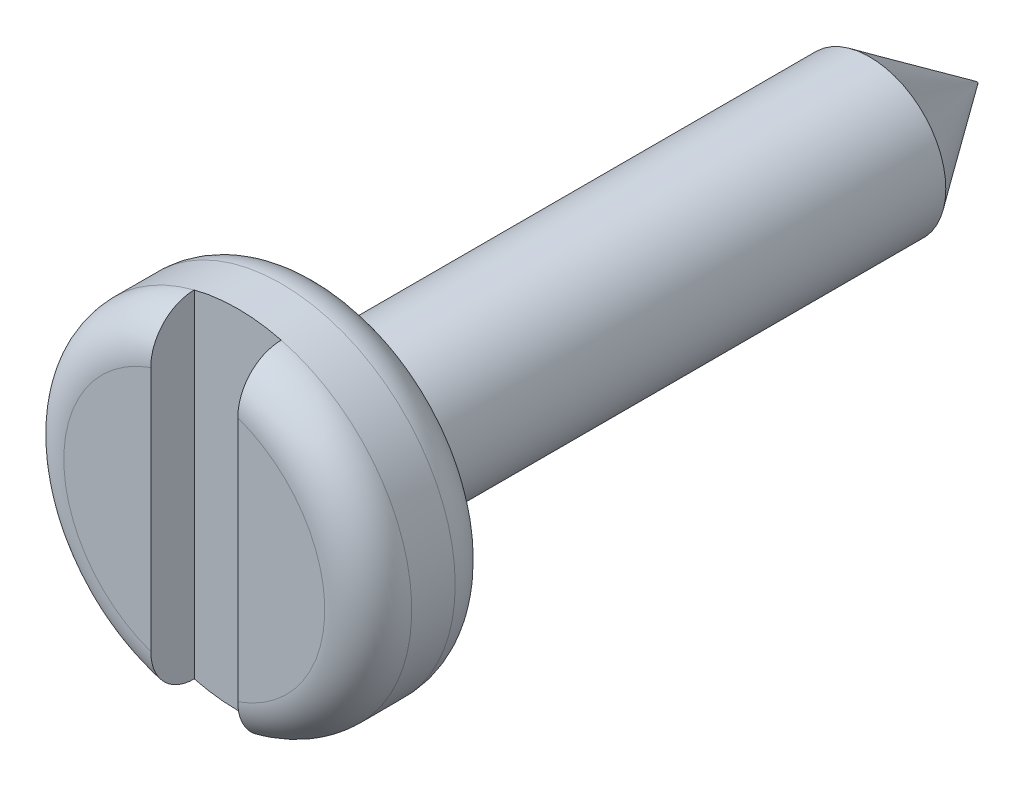
ISO-10303-21;
HEADER;
FILE_DESCRIPTION(('STEP AP214'),'2;1');
FILE_NAME('part.step','',(''),(''),'','','');
FILE_SCHEMA(('AUTOMOTIVE_DESIGN { 1 0 10303 214 1 1 1 1 }'));
ENDSEC;
DATA;
#1=APPLICATION_CONTEXT('core data for automotive mechanical design processes');
#2=APPLICATION_PROTOCOL_DEFINITION('international standard','automotive_design',2000,#1);
#3=PRODUCT_CONTEXT('',#1,'mechanical');
#4=PRODUCT('Part','Part','',(#3));
#5=PRODUCT_RELATED_PRODUCT_CATEGORY('part','',(#4));
#6=PRODUCT_DEFINITION_FORMATION('','',#4);
#7=PRODUCT_DEFINITION_CONTEXT('part definition',#1,'design');
#8=PRODUCT_DEFINITION('design','',#6,#7);
#9=PRODUCT_DEFINITION_SHAPE('','',#8);
#10=(LENGTH_UNIT() NAMED_UNIT(*) SI_UNIT(.MILLI.,.METRE.));
#11=(NAMED_UNIT(*) PLANE_ANGLE_UNIT() SI_UNIT($,.RADIAN.));
#12=(NAMED_UNIT(*) SI_UNIT($,.STERADIAN.) SOLID_ANGLE_UNIT());
#13=UNCERTAINTY_MEASURE_WITH_UNIT(LENGTH_MEASURE(1.E-05),#10,'distance_accuracy_value','');
#14=(GEOMETRIC_REPRESENTATION_CONTEXT(3) GLOBAL_UNCERTAINTY_ASSIGNED_CONTEXT((#13)) GLOBAL_UNIT_ASSIGNED_CONTEXT((#10,
#11,#12)) REPRESENTATION_CONTEXT('',''));
#15=CARTESIAN_POINT('',(0.,0.,0.));
#16=DIRECTION('',(0.,0.,1.));
#17=DIRECTION('',(1.,0.,0.));
#18=AXIS2_PLACEMENT_3D('',#15,#16,#17);
#19=CARTESIAN_POINT('',(0.,0.,3.));
#20=DIRECTION('',(0.,0.,1.));
#21=DIRECTION('',(1.,0.,0.));
#22=AXIS2_PLACEMENT_3D('',#19,#20,#21);
#23=PLANE('',#22);
#24=DIRECTION('',(0.,1.,0.));
#25=VECTOR('',#24,1.);
#26=CARTESIAN_POINT('',(1.,-5.25777871776012,3.));
#27=LINE('',#26,#25);
#28=CARTESIAN_POINT('',(1.,-2.82842712474619,3.));
#29=VERTEX_POINT('',#28);
#30=CARTESIAN_POINT('',(1.,2.82842712474619,3.));
#31=VERTEX_POINT('',#30);
#32=EDGE_CURVE('E80',#29,#31,#27,.T.);
#33=ORIENTED_EDGE('',*,*,#32,.F.);
#34=CARTESIAN_POINT('',(0.,0.,3.));
#35=DIRECTION('',(0.,0.,1.));
#36=DIRECTION('',(1.,0.,0.));
#37=AXIS2_PLACEMENT_3D('',#34,#35,#36);
#38=CIRCLE('',#37,3.);
#39=EDGE_CURVE('E91',#29,#31,#38,.T.);
#40=ORIENTED_EDGE('',*,*,#39,.T.);
#41=EDGE_LOOP('',(#33,#40));
#42=FACE_BOUND('',#41,.T.);
#43=ADVANCED_FACE('F36',(#42),#23,.T.);
#44=CARTESIAN_POINT('',(0.,0.,2.));
#45=DIRECTION('',(0.,0.,1.));
#46=DIRECTION('',(1.,0.,0.));
#47=AXIS2_PLACEMENT_3D('',#44,#45,#46);
#48=TOROIDAL_SURFACE('',#47,3.,1.);
#49=CARTESIAN_POINT('',(1.,-3.64919261637876,2.6211026661572));
#50=CARTESIAN_POINT('',(1.,-3.61246829124284,2.66579002494271));
#51=CARTESIAN_POINT('',(1.,-3.57182273981753,2.70732733314953));
#52=CARTESIAN_POINT('',(1.,-3.48403011681508,2.78294045930634));
#53=CARTESIAN_POINT('',(1.,-3.43687198294722,2.81700332070253));
#54=CARTESIAN_POINT('',(1.,-3.33766471841515,2.87674097422314));
#55=CARTESIAN_POINT('',(1.,-3.28562703698927,2.90243479890157));
#56=CARTESIAN_POINT('',(1.,-3.17810296997573,2.94502972447431));
#57=CARTESIAN_POINT('',(1.,-3.12261754108754,2.96193325245766));
#58=CARTESIAN_POINT('',(1.,-3.00777317104801,2.98715700817281));
#59=CARTESIAN_POINT('',(1.,-2.94834671261764,2.99516919827913));
#60=CARTESIAN_POINT('',(1.,-2.82897631989347,3.00159564116463));
#61=CARTESIAN_POINT('',(1.,-2.76903224055403,3.00000711035689));
#62=CARTESIAN_POINT('',(1.,-2.64727083843189,2.9871577074426));
#63=CARTESIAN_POINT('',(1.,-2.58550212430651,2.97543521119548));
#64=CARTESIAN_POINT('',(1.,-2.4646697470406,2.94214822582074));
#65=CARTESIAN_POINT('',(1.,-2.40560678606223,2.92058119770941));
#66=CARTESIAN_POINT('',(1.,-2.28977043599634,2.86727838900606));
#67=CARTESIAN_POINT('',(1.,-2.23314594038648,2.83521799768237));
#68=CARTESIAN_POINT('',(1.,-2.12614398768344,2.76191505713469));
#69=CARTESIAN_POINT('',(1.,-2.07576824200821,2.72067000100721));
#70=CARTESIAN_POINT('',(1.,-1.98379387873605,2.63055763944395));
#71=CARTESIAN_POINT('',(1.,-1.94207572966021,2.58181298471903));
#72=CARTESIAN_POINT('',(1.,-1.86845583157665,2.47738621897952));
#73=CARTESIAN_POINT('',(1.,-1.83654566049022,2.42171011803187));
#74=CARTESIAN_POINT('',(1.,-1.78709737368201,2.31073529638438));
#75=CARTESIAN_POINT('',(1.,-1.76846247440006,2.25592758061431));
#76=CARTESIAN_POINT('',(1.,-1.74214733309541,2.14375873883025));
#77=CARTESIAN_POINT('',(1.,-1.73445420066598,2.086400699661));
#78=CARTESIAN_POINT('',(1.,-1.73084715779128,1.97843775997684));
#79=CARTESIAN_POINT('',(1.,-1.7335962352882,1.92787339768217));
#80=CARTESIAN_POINT('',(1.,-1.74776639815729,1.82798056341897));
#81=CARTESIAN_POINT('',(1.,-1.75918748554878,1.77865209173822));
#82=CARTESIAN_POINT('',(1.,-1.78968272820642,1.68365989826979));
#83=CARTESIAN_POINT('',(1.,-1.8085812374816,1.63793910856491));
#84=CARTESIAN_POINT('',(1.,-1.85313687686153,1.54993212977883));
#85=CARTESIAN_POINT('',(1.,-1.87879592715948,1.50764692097559));
#86=CARTESIAN_POINT('',(1.,-1.93861992774949,1.42344159371426));
#87=CARTESIAN_POINT('',(1.,-1.9733576123982,1.38192920716076));
#88=CARTESIAN_POINT('',(1.,-2.04862460837548,1.30454213941451));
#89=CARTESIAN_POINT('',(1.,-2.08915670758346,1.26867018956461));
#90=CARTESIAN_POINT('',(1.,-2.18006426230812,1.19918972913197));
#91=CARTESIAN_POINT('',(1.,-2.23103714592975,1.16636107677538));
#92=CARTESIAN_POINT('',(1.,-2.33749595959869,1.10908092926408));
#93=CARTESIAN_POINT('',(1.,-2.39298358522971,1.08463259961096));
#94=CARTESIAN_POINT('',(1.,-2.51097262656985,1.0433220937882));
#95=CARTESIAN_POINT('',(1.,-2.57369454510079,1.02708587787039));
#96=CARTESIAN_POINT('',(1.,-2.700983475594,1.00537639094104));
#97=CARTESIAN_POINT('',(1.,-2.76555060284081,0.99990379391447));
#98=CARTESIAN_POINT('',(1.,-2.89460991780328,1.00009863370848));
#99=CARTESIAN_POINT('',(1.,-2.95910210766962,1.00575347593341));
#100=CARTESIAN_POINT('',(1.,-3.08610159103586,1.02829216053746));
#101=CARTESIAN_POINT('',(1.,-3.14860929616319,1.04517365809634));
#102=CARTESIAN_POINT('',(1.,-3.26706008823211,1.08898927984344));
#103=CARTESIAN_POINT('',(1.,-3.32316790541548,1.1154775406286));
#104=CARTESIAN_POINT('',(1.,-3.42981180048591,1.17797155695129));
#105=CARTESIAN_POINT('',(1.,-3.48034948276044,1.21397456171506));
#106=CARTESIAN_POINT('',(1.,-3.5717549595939,1.2925348236677));
#107=CARTESIAN_POINT('',(1.,-3.61297761225985,1.33467936693552));
#108=CARTESIAN_POINT('',(1.,-3.68739921164548,1.42554288437418));
#109=CARTESIAN_POINT('',(1.,-3.72060013192047,1.47426023685665));
#110=CARTESIAN_POINT('',(1.,-3.77666180946586,1.57475604354721));
#111=CARTESIAN_POINT('',(1.,-3.79988449445979,1.62633279669513));
#112=CARTESIAN_POINT('',(1.,-3.8370874932321,1.73271545651262));
#113=CARTESIAN_POINT('',(1.,-3.85106974548789,1.78752068327712));
#114=CARTESIAN_POINT('',(1.,-3.86908893013128,1.89732662152739));
#115=CARTESIAN_POINT('',(1.,-3.8733663936881,1.95228799006894));
#116=CARTESIAN_POINT('',(1.,-3.87254642808437,2.06215628299846));
#117=CARTESIAN_POINT('',(1.,-3.86744696286752,2.11706319297142));
#118=CARTESIAN_POINT('',(1.,-3.84811915821359,2.22478524017462));
#119=CARTESIAN_POINT('',(1.,-3.83396358370818,2.27761351927618));
#120=CARTESIAN_POINT('',(1.,-3.7970545910158,2.38011640408008));
#121=CARTESIAN_POINT('',(1.,-3.77431302491925,2.42979524735174));
#122=CARTESIAN_POINT('',(1.,-3.73340181697249,2.50259332314218));
#123=CARTESIAN_POINT('',(1.,-3.71802299051624,2.52732160058586));
#124=CARTESIAN_POINT('',(1.,-3.6851578718343,2.57533329531705));
#125=CARTESIAN_POINT('',(1.,-3.66767165706015,2.59861676565705));
#126=CARTESIAN_POINT('',(1.,-3.64919261637876,2.6211026661572));
#127=B_SPLINE_CURVE_WITH_KNOTS('',3,(#49,#50,#51,#52,#53,#54,#55,#56,#57,#58,#59,#60,#61,#62,
#63,#64,#65,#66,#67,#68,#69,#70,#71,#72,#73,#74,#75,#76,#77,#78,#79,#80,#81,#82,#83,#84,#85,#86,
#87,#88,#89,#90,#91,#92,#93,#94,#95,#96,#97,#98,#99,#100,#101,#102,#103,#104,#105,#106,#107,
#108,#109,#110,#111,#112,#113,#114,#115,#116,#117,#118,#119,#120,#121,#122,#123,#124,#125,#126),
.UNSPECIFIED.,.T.,.F.,(4,2,2,2,2,2,2,2,2,2,2,2,2,2,2,2,2,2,2,2,2,2,2,2,2,2,2,2,2,2,2,2,2,2,2,2,
2,2,4),(0.,0.17341289048321,0.347124049007961,0.520437356131996,0.69370278427219,
0.872799829737299,1.0519488042302,1.23971596911835,1.42753158804966,1.62181514087839,
1.81615178746787,2.00759452225808,2.19887240354153,2.37152756897142,2.54397916179065,
2.69513969078691,2.8463002549815,2.99410284817722,3.14194746701218,3.30368559089984,
3.4655017957534,3.64661194733467,3.82779043451023,4.02124009008946,4.21470185851019,
4.40794478311448,4.60114735931068,4.78633868776633,4.97147653467569,5.14744892261805,
5.32337797257932,5.49223680329954,5.6610601992052,5.82565137676776,5.99027829700087,
6.15359879124429,6.31669465754746,6.40395620932971,6.49121455501904),.UNSPECIFIED.);
#128=CARTESIAN_POINT('',(1.,-3.87298334620742,2.));
#129=VERTEX_POINT('',#128);
#130=EDGE_CURVE('E77',#129,#29,#127,.T.);
#131=ORIENTED_EDGE('',*,*,#130,.F.);
#132=CARTESIAN_POINT('',(0.,0.,2.));
#133=DIRECTION('',(0.,0.,1.));
#134=DIRECTION('',(1.,0.,0.));
#135=AXIS2_PLACEMENT_3D('',#132,#133,#134);
#136=CIRCLE('',#135,4.);
#137=CARTESIAN_POINT('',(1.,3.87298334620742,2.));
#138=VERTEX_POINT('',#137);
#139=EDGE_CURVE('E177',#138,#129,#136,.F.);
#140=ORIENTED_EDGE('',*,*,#139,.F.);
#141=CARTESIAN_POINT('',(1.,1.80454052912611,2.34958766832458));
#142=CARTESIAN_POINT('',(1.,1.82733564227056,2.40301531347153));
#143=CARTESIAN_POINT('',(1.,1.85512695409011,2.45438971925694));
#144=CARTESIAN_POINT('',(1.,1.91917221491779,2.55165941167524));
#145=CARTESIAN_POINT('',(1.,1.95545034759685,2.59753846325667));
#146=CARTESIAN_POINT('',(1.,2.03472745512996,2.68258486169766));
#147=CARTESIAN_POINT('',(1.,2.07768954567703,2.7217867062309));
#148=CARTESIAN_POINT('',(1.,2.16909853569401,2.7930735569373));
#149=CARTESIAN_POINT('',(1.,2.21754271430982,2.82516207038143));
#150=CARTESIAN_POINT('',(1.,2.32292879249958,2.8840516403355));
#151=CARTESIAN_POINT('',(1.,2.38024241475681,2.91018930933951));
#152=CARTESIAN_POINT('',(1.,2.49835854595117,2.95285912482168));
#153=CARTESIAN_POINT('',(1.,2.55916237767374,2.96938760266272));
#154=CARTESIAN_POINT('',(1.,2.68483407257146,2.99270373861452));
#155=CARTESIAN_POINT('',(1.,2.74976968404556,2.9991297669534));
#156=CARTESIAN_POINT('',(1.,2.87978602000167,3.0007047130659));
#157=CARTESIAN_POINT('',(1.,2.94486673043529,2.99585467892842));
#158=CARTESIAN_POINT('',(1.,3.07160057441872,2.97500301118191));
#159=CARTESIAN_POINT('',(1.,3.13329857714227,2.95927559681278));
#160=CARTESIAN_POINT('',(1.,3.25294779689383,2.91715819140186));
#161=CARTESIAN_POINT('',(1.,3.31090002929504,2.8907711040785));
#162=CARTESIAN_POINT('',(1.,3.41840060401574,2.82944986634712));
#163=CARTESIAN_POINT('',(1.,3.46821977750479,2.79499057017331));
#164=CARTESIAN_POINT('',(1.,3.56099783551873,2.71781891288443));
#165=CARTESIAN_POINT('',(1.,3.60395862641663,2.67510885249285));
#166=CARTESIAN_POINT('',(1.,3.67969826358568,2.58481461557238));
#167=CARTESIAN_POINT('',(1.,3.71285769774479,2.53754946305995));
#168=CARTESIAN_POINT('',(1.,3.77044619987703,2.43796937327648));
#169=CARTESIAN_POINT('',(1.,3.79487711958101,2.38565551007047));
#170=CARTESIAN_POINT('',(1.,3.8335016955855,2.27936335145154));
#171=CARTESIAN_POINT('',(1.,3.84801099359635,2.22549959047232));
#172=CARTESIAN_POINT('',(1.,3.86760231954654,2.11608517443674));
#173=CARTESIAN_POINT('',(1.,3.87268548576308,2.06053472388451));
#174=CARTESIAN_POINT('',(1.,3.8732508221602,1.95035504782268));
#175=CARTESIAN_POINT('',(1.,3.86889832192387,1.89572659120488));
#176=CARTESIAN_POINT('',(1.,3.85107174509836,1.78798168894991));
#177=CARTESIAN_POINT('',(1.,3.83759798402113,1.73486519107906));
#178=CARTESIAN_POINT('',(1.,3.80198008919852,1.63168371377876));
#179=CARTESIAN_POINT('',(1.,3.77984406569282,1.58161593044612));
#180=CARTESIAN_POINT('',(1.,3.72759926122775,1.48583394126099));
#181=CARTESIAN_POINT('',(1.,3.69749012843155,1.44011992765242));
#182=CARTESIAN_POINT('',(1.,3.62971259861727,1.35357917161315));
#183=CARTESIAN_POINT('',(1.,3.59193770980213,1.31283590863564));
#184=CARTESIAN_POINT('',(1.,3.51026030542915,1.23804950219452));
#185=CARTESIAN_POINT('',(1.,3.46635709112837,1.20400712382448));
#186=CARTESIAN_POINT('',(1.,3.37229757441458,1.1424726173594));
#187=CARTESIAN_POINT('',(1.,3.3219939157208,1.11520592258916));
#188=CARTESIAN_POINT('',(1.,3.21766120608909,1.06912019119455));
#189=CARTESIAN_POINT('',(1.,3.16363149652713,1.05030265249747));
#190=CARTESIAN_POINT('',(1.,3.05096434144294,1.02078522720702));
#191=CARTESIAN_POINT('',(1.,2.99222867204826,1.01046061252006));
#192=CARTESIAN_POINT('',(1.,2.87386575261448,0.999331319218379));
#193=CARTESIAN_POINT('',(1.,2.81423829904846,0.998528848039069));
#194=CARTESIAN_POINT('',(1.,2.69274321411743,1.00645205739125));
#195=CARTESIAN_POINT('',(1.,2.63090545892967,1.01563700166145));
#196=CARTESIAN_POINT('',(1.,2.50951757591248,1.04386266996607));
#197=CARTESIAN_POINT('',(1.,2.44996803355343,1.06290589857502));
#198=CARTESIAN_POINT('',(1.,2.33251699096482,1.11120194285693));
#199=CARTESIAN_POINT('',(1.,2.27476209452056,1.1408123586987));
#200=CARTESIAN_POINT('',(1.,2.16504100441597,1.20936090341473));
#201=CARTESIAN_POINT('',(1.,2.1130766184798,1.24830193330297));
#202=CARTESIAN_POINT('',(1.,2.01702604048045,1.33440542147592));
#203=CARTESIAN_POINT('',(1.,1.97289236593093,1.38151464491305));
#204=CARTESIAN_POINT('',(1.,1.89405458528472,1.48307465886792));
#205=CARTESIAN_POINT('',(1.,1.8593436749435,1.53752010910422));
#206=CARTESIAN_POINT('',(1.,1.80395346955058,1.6472212237122));
#207=CARTESIAN_POINT('',(1.,1.78231146726499,1.701988240954));
#208=CARTESIAN_POINT('',(1.,1.75007375885358,1.81468813753041));
#209=CARTESIAN_POINT('',(1.,1.73946751412064,1.87261794080383));
#210=CARTESIAN_POINT('',(1.,1.73072871128562,1.98197840524538));
#211=CARTESIAN_POINT('',(1.,1.73118407976636,2.03330096094744));
#212=CARTESIAN_POINT('',(1.,1.74110754539552,2.13501149229802));
#213=CARTESIAN_POINT('',(1.,1.75056109441266,2.18540084269791));
#214=CARTESIAN_POINT('',(1.,1.76962628570817,2.25416086039941));
#215=CARTESIAN_POINT('',(1.,1.775725641812,2.27356752733858));
#216=CARTESIAN_POINT('',(1.,1.78919300721113,2.31192913575159));
#217=CARTESIAN_POINT('',(1.,1.79656062731025,2.33088421378046));
#218=CARTESIAN_POINT('',(1.,1.80454052912611,2.34958766832458));
#219=B_SPLINE_CURVE_WITH_KNOTS('',3,(#141,#142,#143,#144,#145,#146,#147,#148,#149,#150,#151,
#152,#153,#154,#155,#156,#157,#158,#159,#160,#161,#162,#163,#164,#165,#166,#167,#168,#169,#170,
#171,#172,#173,#174,#175,#176,#177,#178,#179,#180,#181,#182,#183,#184,#185,#186,#187,#188,#189,
#190,#191,#192,#193,#194,#195,#196,#197,#198,#199,#200,#201,#202,#203,#204,#205,#206,#207,#208,
#209,#210,#211,#212,#213,#214,#215,#216,#217,#218),.UNSPECIFIED.,.T.,.F.,(4,2,2,2,2,2,2,2,2,2,2,
2,2,2,2,2,2,2,2,2,2,2,2,2,2,2,2,2,2,2,2,2,2,2,2,2,2,2,4),(0.,0.174178142462621,
0.348858794655957,0.522607622456415,0.69627059085576,0.884404317135718,1.07260982280651,
1.26741035602158,1.46219278361548,1.65223564412789,1.84222677141603,2.0230332306349,
2.20378934460626,2.3761397314861,2.54845353295372,2.71499259832305,2.8815115515218,
3.04513641034001,3.20875560952792,3.37222198165287,3.53569556841308,3.70161824784469,
3.86755986102035,4.03844662852224,4.20936368011134,4.3874792701433,4.56563615035137,
4.75234573977393,4.93910278752957,5.13289556741605,5.32674867845842,5.51938286742826,
5.71187758161893,5.88751215743834,6.06297885648947,6.21617952361257,6.36913291804395,
6.43012627085521,6.49110093970256),.UNSPECIFIED.);
#220=EDGE_CURVE('E87',#31,#138,#219,.T.);
#221=ORIENTED_EDGE('',*,*,#220,.F.);
#222=ORIENTED_EDGE('',*,*,#39,.F.);
#223=EDGE_LOOP('',(#131,#140,#221,#222));
#224=FACE_BOUND('',#223,.T.);
#225=ADVANCED_FACE('F94',(#224),#48,.T.);
#226=CARTESIAN_POINT('',(0.,0.,3.));
#227=DIRECTION('',(0.,0.,-1.));
#228=DIRECTION('',(-1.,0.,0.));
#229=AXIS2_PLACEMENT_3D('',#226,#227,#228);
#230=CYLINDRICAL_SURFACE('',#229,4.);
#231=CARTESIAN_POINT('',(0.,0.,1.));
#232=DIRECTION('',(0.,0.,1.));
#233=DIRECTION('',(1.,0.,0.));
#234=AXIS2_PLACEMENT_3D('',#231,#232,#233);
#235=CIRCLE('',#234,4.);
#236=CARTESIAN_POINT('',(4.,0.,1.));
#237=VERTEX_POINT('',#236);
#238=EDGE_CURVE('E101',#237,#237,#235,.T.);
#239=ORIENTED_EDGE('',*,*,#238,.T.);
#240=EDGE_LOOP('',(#239));
#241=FACE_BOUND('',#240,.T.);
#242=CARTESIAN_POINT('',(-1.,-3.87298334620742,2.));
#243=VERTEX_POINT('',#242);
#244=EDGE_CURVE('E183',#129,#243,#136,.F.);
#245=ORIENTED_EDGE('',*,*,#244,.T.);
#246=CARTESIAN_POINT('',(-1.,3.87298334620742,2.));
#247=VERTEX_POINT('',#246);
#248=EDGE_CURVE('E175',#243,#247,#136,.F.);
#249=ORIENTED_EDGE('',*,*,#248,.T.);
#250=EDGE_CURVE('E180',#247,#138,#136,.F.);
#251=ORIENTED_EDGE('',*,*,#250,.T.);
#252=ORIENTED_EDGE('',*,*,#139,.T.);
#253=EDGE_LOOP('',(#245,#249,#251,#252));
#254=FACE_BOUND('',#253,.T.);
#255=ADVANCED_FACE('F156',(#241,#254),#230,.T.);
#256=DIRECTION('',(0.,-1.,0.));
#257=VECTOR('',#256,1.);
#258=CARTESIAN_POINT('',(-1.,-5.25777871776012,3.));
#259=LINE('',#258,#257);
#260=CARTESIAN_POINT('',(-1.,2.82842712474619,3.));
#261=VERTEX_POINT('',#260);
#262=CARTESIAN_POINT('',(-1.,-2.82842712474619,3.));
#263=VERTEX_POINT('',#262);
#264=EDGE_CURVE('E92',#261,#263,#259,.T.);
#265=ORIENTED_EDGE('',*,*,#264,.F.);
#266=EDGE_CURVE('E95',#261,#263,#38,.T.);
#267=ORIENTED_EDGE('',*,*,#266,.T.);
#268=EDGE_LOOP('',(#265,#267));
#269=FACE_BOUND('',#268,.T.);
#270=ADVANCED_FACE('F128',(#269),#23,.T.);
#271=CARTESIAN_POINT('',(0.,0.,0.));
#272=DIRECTION('',(0.,0.,1.));
#273=DIRECTION('',(1.,0.,0.));
#274=AXIS2_PLACEMENT_3D('',#271,#272,#273);
#275=PLANE('',#274);
#276=CARTESIAN_POINT('',(0.,0.,0.));
#277=DIRECTION('',(0.,0.,1.));
#278=DIRECTION('',(1.,0.,0.));
#279=AXIS2_PLACEMENT_3D('',#276,#277,#278);
#280=CIRCLE('',#279,1.75);
#281=CARTESIAN_POINT('',(1.75,0.,0.));
#282=VERTEX_POINT('',#281);
#283=EDGE_CURVE('E86',#282,#282,#280,.F.);
#284=ORIENTED_EDGE('',*,*,#283,.F.);
#285=EDGE_LOOP('',(#284));
#286=FACE_BOUND('',#285,.T.);
#287=CARTESIAN_POINT('',(0.,0.,0.));
#288=DIRECTION('',(0.,0.,1.));
#289=DIRECTION('',(1.,0.,0.));
#290=AXIS2_PLACEMENT_3D('',#287,#288,#289);
#291=CIRCLE('',#290,3.);
#292=CARTESIAN_POINT('',(3.,0.,0.));
#293=VERTEX_POINT('',#292);
#294=EDGE_CURVE('E96',#293,#293,#291,.F.);
#295=ORIENTED_EDGE('',*,*,#294,.T.);
#296=EDGE_LOOP('',(#295));
#297=FACE_BOUND('',#296,.T.);
#298=ADVANCED_FACE('F158',(#286,#297),#275,.F.);
#299=CARTESIAN_POINT('',(0.,0.,1.));
#300=DIRECTION('',(0.,0.,1.));
#301=DIRECTION('',(1.,0.,0.));
#302=AXIS2_PLACEMENT_3D('',#299,#300,#301);
#303=TOROIDAL_SURFACE('',#302,3.,1.);
#304=ORIENTED_EDGE('',*,*,#294,.F.);
#305=EDGE_LOOP('',(#304));
#306=FACE_BOUND('',#305,.T.);
#307=ORIENTED_EDGE('',*,*,#238,.F.);
#308=EDGE_LOOP('',(#307));
#309=FACE_BOUND('',#308,.T.);
#310=ADVANCED_FACE('F164',(#306,#309),#303,.T.);
#311=CARTESIAN_POINT('',(-1.,-3.64919261637876,2.6211026661572));
#312=CARTESIAN_POINT('',(-1.,-3.68421774880566,2.57847472645557));
#313=CARTESIAN_POINT('',(-1.,-3.71573121866812,2.53291579197715));
#314=CARTESIAN_POINT('',(-1.,-3.77072271793606,2.43713622500992));
#315=CARTESIAN_POINT('',(-1.,-3.7941932176755,2.38691127989336));
#316=CARTESIAN_POINT('',(-1.,-3.83232306529217,2.28319295511143));
#317=CARTESIAN_POINT('',(-1.,-3.84697939804536,2.2296984638952));
#318=CARTESIAN_POINT('',(-1.,-3.86697833853991,2.12100624575044));
#319=CARTESIAN_POINT('',(-1.,-3.87232301456639,2.06580889982909));
#320=CARTESIAN_POINT('',(-1.,-3.8735215186672,1.95595137624274));
#321=CARTESIAN_POINT('',(-1.,-3.86948428851038,1.90129236054302));
#322=CARTESIAN_POINT('',(-1.,-3.85227604476183,1.79343329540184));
#323=CARTESIAN_POINT('',(-1.,-3.83910509251853,1.74023323616351));
#324=CARTESIAN_POINT('',(-1.,-3.80407540261861,1.63684967195569));
#325=CARTESIAN_POINT('',(-1.,-3.78222699198927,1.58666266259676));
#326=CARTESIAN_POINT('',(-1.,-3.73053163039543,1.49059776377787));
#327=CARTESIAN_POINT('',(-1.,-3.70068434688085,1.44472005358248));
#328=CARTESIAN_POINT('',(-1.,-3.63341013265124,1.35782232845749));
#329=CARTESIAN_POINT('',(-1.,-3.59587810431412,1.31688375254111));
#330=CARTESIAN_POINT('',(-1.,-3.51465000927728,1.24167159196273));
#331=CARTESIAN_POINT('',(-1.,-3.47095325435915,1.20739875246842));
#332=CARTESIAN_POINT('',(-1.,-3.37728222045449,1.14537591116373));
#333=CARTESIAN_POINT('',(-1.,-3.3271605468789,1.11784870172972));
#334=CARTESIAN_POINT('',(-1.,-3.22314696513099,1.07121765103905));
#335=CARTESIAN_POINT('',(-1.,-3.16925439308441,1.05211529734026));
#336=CARTESIAN_POINT('',(-1.,-3.05682907266059,1.02200233317672));
#337=CARTESIAN_POINT('',(-1.,-2.99819650992226,1.01136472633378));
#338=CARTESIAN_POINT('',(-1.,-2.87998845672231,0.999597159087044));
#339=CARTESIAN_POINT('',(-1.,-2.82041275056072,0.998469406032896));
#340=CARTESIAN_POINT('',(-1.,-2.6989710313189,1.00572120914571));
#341=CARTESIAN_POINT('',(-1.,-2.63713235610346,1.01455974301554));
#342=CARTESIAN_POINT('',(-1.,-2.51568597409779,1.04209346894638));
#343=CARTESIAN_POINT('',(-1.,-2.45607883234357,1.06079113955473));
#344=CARTESIAN_POINT('',(-1.,-2.33842761694778,1.10839859874429));
#345=CARTESIAN_POINT('',(-1.,-2.28052948653964,1.13767013151471));
#346=CARTESIAN_POINT('',(-1.,-2.17045977140093,1.20555902280728));
#347=CARTESIAN_POINT('',(-1.,-2.11828996854252,1.24417927746901));
#348=CARTESIAN_POINT('',(-1.,-2.02170750318936,1.3297146261891));
#349=CARTESIAN_POINT('',(-1.,-1.97725596550883,1.37658560459012));
#350=CARTESIAN_POINT('',(-1.,-1.89772373636244,1.47772399304761));
#351=CARTESIAN_POINT('',(-1.,-1.86263706889656,1.53198665269858));
#352=CARTESIAN_POINT('',(-1.,-1.80643405929272,1.64149392045972));
#353=CARTESIAN_POINT('',(-1.,-1.78437537934672,1.69625224610533));
#354=CARTESIAN_POINT('',(-1.,-1.7513214578145,1.80899518407948));
#355=CARTESIAN_POINT('',(-1.,-1.74031171809329,1.86697546286986));
#356=CARTESIAN_POINT('',(-1.,-1.73085902055684,1.97646312088746));
#357=CARTESIAN_POINT('',(-1.,-1.73099013277703,2.02785099744825));
#358=CARTESIAN_POINT('',(-1.,-1.74029509334647,2.12979566946175));
#359=CARTESIAN_POINT('',(-1.,-1.74946799175208,2.1803525516527));
#360=CARTESIAN_POINT('',(-1.,-1.77571772659471,2.27709171669771));
#361=CARTESIAN_POINT('',(-1.,-1.79245157525915,2.32336845641954));
#362=CARTESIAN_POINT('',(-1.,-1.83286691955322,2.41276857892226));
#363=CARTESIAN_POINT('',(-1.,-1.85655018472788,2.45589115505352));
#364=CARTESIAN_POINT('',(-1.,-1.91213942825225,2.54160183968982));
#365=CARTESIAN_POINT('',(-1.,-1.94456151624895,2.58385424322565));
#366=CARTESIAN_POINT('',(-1.,-2.01532201572512,2.66306759784098));
#367=CARTESIAN_POINT('',(-1.,-2.05366319916079,2.70002605401165));
#368=CARTESIAN_POINT('',(-1.,-2.14017350344001,2.77224398699223));
#369=CARTESIAN_POINT('',(-1.,-2.18897066641048,2.80675248760614));
#370=CARTESIAN_POINT('',(-1.,-2.29132619189354,2.8677939228219));
#371=CARTESIAN_POINT('',(-1.,-2.34488650876452,2.89432356389141));
#372=CARTESIAN_POINT('',(-1.,-2.45975220218697,2.94057454426968));
#373=CARTESIAN_POINT('',(-1.,-2.52133607697502,2.95960797735071));
#374=CARTESIAN_POINT('',(-1.,-2.64681911964728,2.98716129435405));
#375=CARTESIAN_POINT('',(-1.,-2.71071844991052,2.99568043945236));
#376=CARTESIAN_POINT('',(-1.,-2.83952321891512,3.00179756049557));
#377=CARTESIAN_POINT('',(-1.,-2.90443259956797,2.99931496617844));
#378=CARTESIAN_POINT('',(-1.,-3.03284571779345,2.98303985309616));
#379=CARTESIAN_POINT('',(-1.,-3.09634932690877,2.96924630509828));
#380=CARTESIAN_POINT('',(-1.,-3.21753834111487,2.93122143040948));
#381=CARTESIAN_POINT('',(-1.,-3.27535260668029,2.9074006980033));
#382=CARTESIAN_POINT('',(-1.,-3.38579347545679,2.84990804392504));
#383=CARTESIAN_POINT('',(-1.,-3.43842837966274,2.81625224042258));
#384=CARTESIAN_POINT('',(-1.,-3.5172967723212,2.75506707182909));
#385=CARTESIAN_POINT('',(-1.,-3.5457566600515,2.73035514327298));
#386=CARTESIAN_POINT('',(-1.,-3.59975362196187,2.67791794279191));
#387=CARTESIAN_POINT('',(-1.,-3.62529080212466,2.65019278020344));
#388=CARTESIAN_POINT('',(-1.,-3.64919261637876,2.6211026661572));
#389=B_SPLINE_CURVE_WITH_KNOTS('',3,(#311,#312,#313,#314,#315,#316,#317,#318,#319,#320,#321,
#322,#323,#324,#325,#326,#327,#328,#329,#330,#331,#332,#333,#334,#335,#336,#337,#338,#339,#340,
#341,#342,#343,#344,#345,#346,#347,#348,#349,#350,#351,#352,#353,#354,#355,#356,#357,#358,#359,
#360,#361,#362,#363,#364,#365,#366,#367,#368,#369,#370,#371,#372,#373,#374,#375,#376,#377,#378,
#379,#380,#381,#382,#383,#384,#385,#386,#387,#388),.UNSPECIFIED.,.T.,.F.,(4,2,2,2,2,2,2,2,2,2,2,
2,2,2,2,2,2,2,2,2,2,2,2,2,2,2,2,2,2,2,2,2,2,2,2,2,2,2,4),(0.,0.165380840917981,
0.330916087751577,0.496507928228474,0.662062983111424,0.825705250260756,0.989346418285467,
1.15279341803051,1.31624721407641,1.48210686649335,1.64798504984166,1.81876717256352,
1.98957943784094,2.16755619619961,2.34557426393417,2.5321377268739,2.71874811349508,
2.91246419841399,3.1062403715924,3.29901028573085,3.49165689199226,3.66772640012856,
3.84356457111482,3.99693575215231,4.15029082150036,4.29729623412107,4.44433911158016,
4.60347661430523,4.76268886964584,4.9412299082907,5.11984454469074,5.31231684657553,
5.50480267244432,5.69870047136714,5.89261591584996,6.07926324301833,6.2656063831334,
6.37846949761758,6.49132851818112),.UNSPECIFIED.);
#390=EDGE_CURVE('E59',#263,#243,#389,.T.);
#391=ORIENTED_EDGE('',*,*,#390,.F.);
#392=ORIENTED_EDGE('',*,*,#266,.F.);
#393=CARTESIAN_POINT('',(-1.,1.80454052912611,2.34958766832458));
#394=CARTESIAN_POINT('',(-1.,1.78501403077482,2.30381153770667));
#395=CARTESIAN_POINT('',(-1.,1.76912481108878,2.25646764206685));
#396=CARTESIAN_POINT('',(-1.,1.74545627326973,2.1597811521104));
#397=CARTESIAN_POINT('',(-1.,1.73767599847123,2.11043879427919));
#398=CARTESIAN_POINT('',(-1.,1.73069098709458,2.01106965084638));
#399=CARTESIAN_POINT('',(-1.,1.73149900893485,1.96104195726854));
#400=CARTESIAN_POINT('',(-1.,1.74167051475476,1.86186851689972));
#401=CARTESIAN_POINT('',(-1.,1.75103489479043,1.81272286302911));
#402=CARTESIAN_POINT('',(-1.,1.77755723399994,1.71740345309444));
#403=CARTESIAN_POINT('',(-1.,1.79459577474986,1.6711961008421));
#404=CARTESIAN_POINT('',(-1.,1.83559644088642,1.58197505044719));
#405=CARTESIAN_POINT('',(-1.,1.85956068083859,1.53896233274484));
#406=CARTESIAN_POINT('',(-1.,1.91574707512422,1.45345124207098));
#407=CARTESIAN_POINT('',(-1.,1.94849285502419,1.41129784297441));
#408=CARTESIAN_POINT('',(-1.,2.01988292900957,1.33233101150423));
#409=CARTESIAN_POINT('',(-1.,2.05852991416201,1.29552003039326));
#410=CARTESIAN_POINT('',(-1.,2.14565957333874,1.22367049727906));
#411=CARTESIAN_POINT('',(-1.,2.1947666390634,1.1893876974762));
#412=CARTESIAN_POINT('',(-1.,2.29770897470277,1.12885411116866));
#413=CARTESIAN_POINT('',(-1.,2.35154617372093,1.10260662147995));
#414=CARTESIAN_POINT('',(-1.,2.46686810930972,1.05703134360992));
#415=CARTESIAN_POINT('',(-1.,2.52862298141813,1.03838332649067));
#416=CARTESIAN_POINT('',(-1.,2.65438564480137,1.01163728808315));
#417=CARTESIAN_POINT('',(-1.,2.71839366607177,1.00354034704709));
#418=CARTESIAN_POINT('',(-1.,2.84727045860239,0.998305036169789));
#419=CARTESIAN_POINT('',(-1.,2.91214210675368,1.00123503894011));
#420=CARTESIAN_POINT('',(-1.,3.0403814331126,1.01839599979145));
#421=CARTESIAN_POINT('',(-1.,3.1037493860516,1.03262487689179));
#422=CARTESIAN_POINT('',(-1.,3.22453607431628,1.07146280365476));
#423=CARTESIAN_POINT('',(-1.,3.28208995374048,1.09565084266259));
#424=CARTESIAN_POINT('',(-1.,3.39200905737906,1.15383919474728));
#425=CARTESIAN_POINT('',(-1.,3.44437578004923,1.18783666292548));
#426=CARTESIAN_POINT('',(-1.,3.53965306827055,1.26283931671483));
#427=CARTESIAN_POINT('',(-1.,3.58290451098822,1.30341161418621));
#428=CARTESIAN_POINT('',(-1.,3.66161338032175,1.39152156306763));
#429=CARTESIAN_POINT('',(-1.,3.69707281002602,1.43905741911036));
#430=CARTESIAN_POINT('',(-1.,3.75765535872457,1.53758092934516));
#431=CARTESIAN_POINT('',(-1.,3.78314865037526,1.588341170296));
#432=CARTESIAN_POINT('',(-1.,3.82498088593506,1.6935031251629));
#433=CARTESIAN_POINT('',(-1.,3.84132142137438,1.7479042041477));
#434=CARTESIAN_POINT('',(-1.,3.86397953776215,1.85722345008313));
#435=CARTESIAN_POINT('',(-1.,3.87055508466128,1.9120882771556));
#436=CARTESIAN_POINT('',(-1.,3.87429421275349,2.02213587307017));
#437=CARTESIAN_POINT('',(-1.,3.87145858580928,2.07731861477269));
#438=CARTESIAN_POINT('',(-1.,3.85654956233586,2.18582793519144));
#439=CARTESIAN_POINT('',(-1.,3.84457328734161,2.23916790562313));
#440=CARTESIAN_POINT('',(-1.,3.81188510349904,2.34309671440263));
#441=CARTESIAN_POINT('',(-1.,3.79117319754571,2.39368555366216));
#442=CARTESIAN_POINT('',(-1.,3.74152269851127,2.49101691538085));
#443=CARTESIAN_POINT('',(-1.,3.7125370484884,2.53773540579699));
#444=CARTESIAN_POINT('',(-1.,3.64728718366139,2.62577180539736));
#445=CARTESIAN_POINT('',(-1.,3.61102243319901,2.66708931676181));
#446=CARTESIAN_POINT('',(-1.,3.53145089102157,2.74412725892548));
#447=CARTESIAN_POINT('',(-1.,3.48801026512743,2.77970933597314));
#448=CARTESIAN_POINT('',(-1.,3.39594466395101,2.84336567487541));
#449=CARTESIAN_POINT('',(-1.,3.34731895276068,2.87143886902136));
#450=CARTESIAN_POINT('',(-1.,3.24444585860384,2.92037035234877));
#451=CARTESIAN_POINT('',(-1.,3.19006042996429,2.94093816224628));
#452=CARTESIAN_POINT('',(-1.,3.07870138288987,2.97309268466895));
#453=CARTESIAN_POINT('',(-1.,3.02172723339545,2.98467754551327));
#454=CARTESIAN_POINT('',(-1.,2.904036237739,2.99910738996765));
#455=CARTESIAN_POINT('',(-1.,2.84326742888658,3.00152817491806));
#456=CARTESIAN_POINT('',(-1.,2.72212957850214,2.9966155884832));
#457=CARTESIAN_POINT('',(-1.,2.66176061928309,2.98928026780879));
#458=CARTESIAN_POINT('',(-1.,2.54016743525481,2.96464145309172));
#459=CARTESIAN_POINT('',(-1.,2.47903356007013,2.94689110718787));
#460=CARTESIAN_POINT('',(-1.,2.36045802696272,2.9016301398227));
#461=CARTESIAN_POINT('',(-1.,2.30301840956722,2.87411417808366));
#462=CARTESIAN_POINT('',(-1.,2.19207907104105,2.80918399975241));
#463=CARTESIAN_POINT('',(-1.,2.13871379054938,2.77153946988103));
#464=CARTESIAN_POINT('',(-1.,2.03938422850455,2.68753375721719));
#465=CARTESIAN_POINT('',(-1.,1.99341141472037,2.64118275923911));
#466=CARTESIAN_POINT('',(-1.,1.92202374047937,2.55446762369635));
#467=CARTESIAN_POINT('',(-1.,1.89441609559324,2.51589443014764));
#468=CARTESIAN_POINT('',(-1.,1.84495839419815,2.43521460715217));
#469=CARTESIAN_POINT('',(-1.,1.82310551704252,2.39310972212516));
#470=CARTESIAN_POINT('',(-1.,1.80454052912611,2.34958766832458));
#471=B_SPLINE_CURVE_WITH_KNOTS('',3,(#393,#394,#395,#396,#397,#398,#399,#400,#401,#402,#403,
#404,#405,#406,#407,#408,#409,#410,#411,#412,#413,#414,#415,#416,#417,#418,#419,#420,#421,#422,
#423,#424,#425,#426,#427,#428,#429,#430,#431,#432,#433,#434,#435,#436,#437,#438,#439,#440,#441,
#442,#443,#444,#445,#446,#447,#448,#449,#450,#451,#452,#453,#454,#455,#456,#457,#458,#459,#460,
#461,#462,#463,#464,#465,#466,#467,#468,#469,#470),.UNSPECIFIED.,.T.,.F.,(4,2,2,2,2,2,2,2,2,2,2,
2,2,2,2,2,2,2,2,2,2,2,2,2,2,2,2,2,2,2,2,2,2,2,2,2,2,2,4),(0.,0.149148554536907,
0.298279511046726,0.447632041266986,0.597000214073881,0.744120321849421,0.891285396112699,
1.05077942674022,1.21034640823962,1.38925590786663,1.56823871438719,1.76086140940356,
1.95350382418568,2.14734268132878,2.34114584629839,2.52748280590278,2.71376577889491,
2.8907792317187,3.06774712642087,3.23731605857427,3.40685549601413,3.57183112131189,
3.73679286579757,3.90002584186701,4.06325876384109,4.22743923194234,4.3916317862741,
4.55933035639168,4.72705275936769,4.90071055682537,5.07440414134976,5.25604600524081,
5.43772416698673,5.62783456768458,5.8180490898866,6.01302018897483,6.20776461572874,
6.34963856766518,6.4914428514089),.UNSPECIFIED.);
#472=EDGE_CURVE('E99',#247,#261,#471,.T.);
#473=ORIENTED_EDGE('',*,*,#472,.F.);
#474=ORIENTED_EDGE('',*,*,#248,.F.);
#475=EDGE_LOOP('',(#391,#392,#473,#474));
#476=FACE_BOUND('',#475,.T.);
#477=ADVANCED_FACE('F114',(#476),#48,.T.);
#478=CARTESIAN_POINT('',(1.,-5.25777871776012,2.));
#479=DIRECTION('',(1.,0.,0.));
#480=DIRECTION('',(0.,0.,-1.));
#481=AXIS2_PLACEMENT_3D('',#478,#479,#480);
#482=PLANE('',#481);
#483=ORIENTED_EDGE('',*,*,#130,.T.);
#484=ORIENTED_EDGE('',*,*,#32,.T.);
#485=ORIENTED_EDGE('',*,*,#220,.T.);
#486=DIRECTION('',(0.,1.,0.));
#487=VECTOR('',#486,1.);
#488=CARTESIAN_POINT('',(1.,-5.25777871776012,2.));
#489=LINE('',#488,#487);
#490=EDGE_CURVE('E51',#129,#138,#489,.T.);
#491=ORIENTED_EDGE('',*,*,#490,.F.);
#492=EDGE_LOOP('',(#483,#484,#485,#491));
#493=FACE_BOUND('',#492,.T.);
#494=ADVANCED_FACE('F79',(#493),#482,.F.);
#495=CARTESIAN_POINT('',(-1.,-5.25777871776012,2.));
#496=DIRECTION('',(-1.,0.,0.));
#497=DIRECTION('',(0.,0.,1.));
#498=AXIS2_PLACEMENT_3D('',#495,#496,#497);
#499=PLANE('',#498);
#500=ORIENTED_EDGE('',*,*,#390,.T.);
#501=DIRECTION('',(0.,-1.,0.));
#502=VECTOR('',#501,1.);
#503=CARTESIAN_POINT('',(-1.,-5.25777871776012,2.));
#504=LINE('',#503,#502);
#505=EDGE_CURVE('E181',#247,#243,#504,.T.);
#506=ORIENTED_EDGE('',*,*,#505,.F.);
#507=ORIENTED_EDGE('',*,*,#472,.T.);
#508=ORIENTED_EDGE('',*,*,#264,.T.);
#509=EDGE_LOOP('',(#500,#506,#507,#508));
#510=FACE_BOUND('',#509,.T.);
#511=ADVANCED_FACE('F117',(#510),#499,.F.);
#512=CARTESIAN_POINT('',(0.,0.,2.));
#513=DIRECTION('',(0.,0.,-1.));
#514=DIRECTION('',(-1.,0.,0.));
#515=AXIS2_PLACEMENT_3D('',#512,#513,#514);
#516=PLANE('',#515);
#517=ORIENTED_EDGE('',*,*,#244,.F.);
#518=ORIENTED_EDGE('',*,*,#490,.T.);
#519=ORIENTED_EDGE('',*,*,#250,.F.);
#520=ORIENTED_EDGE('',*,*,#505,.T.);
#521=EDGE_LOOP('',(#517,#518,#519,#520));
#522=FACE_BOUND('',#521,.T.);
#523=ADVANCED_FACE('F122',(#522),#516,.F.);
#524=CARTESIAN_POINT('',(0.,0.,-15.));
#525=DIRECTION('',(0.,0.,1.));
#526=DIRECTION('',(1.,0.,0.));
#527=AXIS2_PLACEMENT_3D('',#524,#525,#526);
#528=CYLINDRICAL_SURFACE('',#527,1.75);
#529=CARTESIAN_POINT('',(0.,0.,-12.53));
#530=DIRECTION('',(0.,0.,-1.));
#531=DIRECTION('',(-1.,0.,0.));
#532=AXIS2_PLACEMENT_3D('',#529,#530,#531);
#533=CIRCLE('',#532,1.75);
#534=CARTESIAN_POINT('',(1.75,0.,-12.53));
#535=VERTEX_POINT('',#534);
#536=EDGE_CURVE('E11',#535,#535,#533,.F.);
#537=ORIENTED_EDGE('',*,*,#536,.T.);
#538=EDGE_LOOP('',(#537));
#539=FACE_BOUND('',#538,.T.);
#540=ORIENTED_EDGE('',*,*,#283,.T.);
#541=EDGE_LOOP('',(#540));
#542=FACE_BOUND('',#541,.T.);
#543=ADVANCED_FACE('F149',(#539,#542),#528,.T.);
#544=CARTESIAN_POINT('',(0.,0.,-15.));
#545=DIRECTION('',(0.,0.,-1.));
#546=DIRECTION('',(-1.,0.,0.));
#547=AXIS2_PLACEMENT_3D('',#544,#545,#546);
#548=PLANE('',#547);
#549=CARTESIAN_POINT('',(0.,0.,-15.));
#550=DIRECTION('',(0.,0.,-1.));
#551=DIRECTION('',(-1.,0.,0.));
#552=AXIS2_PLACEMENT_3D('',#549,#550,#551);
#553=CIRCLE('',#552,0.0204873806220213);
#554=CARTESIAN_POINT('',(0.0204873806220219,0.,-15.));
#555=VERTEX_POINT('',#554);
#556=EDGE_CURVE('E44',#555,#555,#553,.T.);
#557=ORIENTED_EDGE('',*,*,#556,.T.);
#558=EDGE_LOOP('',(#557));
#559=FACE_BOUND('',#558,.T.);
#560=ADVANCED_FACE('F142',(#559),#548,.T.);
#561=CARTESIAN_POINT('',(0.,0.,-15.));
#562=DIRECTION('',(0.,0.,1.));
#563=DIRECTION('',(1.,0.,0.));
#564=AXIS2_PLACEMENT_3D('',#561,#562,#563);
#565=CONICAL_SURFACE('',#564,0.0204873806220213,0.610865238198013);
#566=CARTESIAN_POINT('',(1.75,0.,-12.53));
#567=CARTESIAN_POINT('',(1.73198424354815,0.,-12.5557291666667));
#568=CARTESIAN_POINT('',(1.71396848709629,0.,-12.5814583333333));
#569=CARTESIAN_POINT('',(1.67793697419258,0.,-12.6329166666667));
#570=CARTESIAN_POINT('',(1.65992121774073,0.,-12.6586458333333));
#571=CARTESIAN_POINT('',(1.62388970483702,0.,-12.7101041666667));
#572=CARTESIAN_POINT('',(1.60587394838517,0.,-12.7358333333333));
#573=CARTESIAN_POINT('',(1.56984243548146,0.,-12.7872916666667));
#574=CARTESIAN_POINT('',(1.55182667902961,0.,-12.8130208333333));
#575=CARTESIAN_POINT('',(1.5157951661259,0.,-12.8644791666667));
#576=CARTESIAN_POINT('',(1.49777940967405,0.,-12.8902083333333));
#577=CARTESIAN_POINT('',(1.46174789677034,0.,-12.9416666666667));
#578=CARTESIAN_POINT('',(1.44373214031848,0.,-12.9673958333333));
#579=CARTESIAN_POINT('',(1.40770062741478,0.,-13.0188541666667));
#580=CARTESIAN_POINT('',(1.38968487096292,0.,-13.0445833333333));
#581=CARTESIAN_POINT('',(1.35365335805921,0.,-13.0960416666667));
#582=CARTESIAN_POINT('',(1.33563760160736,0.,-13.1217708333333));
#583=CARTESIAN_POINT('',(1.29960608870365,0.,-13.1732291666667));
#584=CARTESIAN_POINT('',(1.2815903322518,0.,-13.1989583333333));
#585=CARTESIAN_POINT('',(1.24555881934809,0.,-13.2504166666667));
#586=CARTESIAN_POINT('',(1.22754306289624,0.,-13.2761458333333));
#587=CARTESIAN_POINT('',(1.19151154999253,0.,-13.3276041666667));
#588=CARTESIAN_POINT('',(1.17349579354067,0.,-13.3533333333333));
#589=CARTESIAN_POINT('',(1.13746428063697,0.,-13.4047916666667));
#590=CARTESIAN_POINT('',(1.11944852418511,0.,-13.4305208333333));
#591=CARTESIAN_POINT('',(1.0834170112814,0.,-13.4819791666667));
#592=CARTESIAN_POINT('',(1.06540125482955,0.,-13.5077083333333));
#593=CARTESIAN_POINT('',(1.02936974192584,0.,-13.5591666666667));
#594=CARTESIAN_POINT('',(1.01135398547399,0.,-13.5848958333333));
#595=CARTESIAN_POINT('',(0.975322472570281,0.,-13.6363541666667));
#596=CARTESIAN_POINT('',(0.957306716118427,0.,-13.6620833333333));
#597=CARTESIAN_POINT('',(0.921275203214719,0.,-13.7135416666667));
#598=CARTESIAN_POINT('',(0.903259446762865,0.,-13.7392708333333));
#599=CARTESIAN_POINT('',(0.867227933859157,0.,-13.7907291666667));
#600=CARTESIAN_POINT('',(0.849212177407303,0.,-13.8164583333333));
#601=CARTESIAN_POINT('',(0.813180664503595,0.,-13.8679166666667));
#602=CARTESIAN_POINT('',(0.795164908051742,0.,-13.8936458333333));
#603=CARTESIAN_POINT('',(0.759133395148034,0.,-13.9451041666667));
#604=CARTESIAN_POINT('',(0.74111763869618,0.,-13.9708333333333));
#605=CARTESIAN_POINT('',(0.705086125792472,0.,-14.0222916666667));
#606=CARTESIAN_POINT('',(0.687070369340618,0.,-14.0480208333333));
#607=CARTESIAN_POINT('',(0.65103885643691,0.,-14.0994791666667));
#608=CARTESIAN_POINT('',(0.633023099985056,0.,-14.1252083333333));
#609=CARTESIAN_POINT('',(0.596991587081348,0.,-14.1766666666667));
#610=CARTESIAN_POINT('',(0.578975830629494,0.,-14.2023958333333));
#611=CARTESIAN_POINT('',(0.542944317725786,0.,-14.2538541666667));
#612=CARTESIAN_POINT('',(0.524928561273933,0.,-14.2795833333333));
#613=CARTESIAN_POINT('',(0.488897048370225,0.,-14.3310416666667));
#614=CARTESIAN_POINT('',(0.470881291918371,0.,-14.3567708333333));
#615=CARTESIAN_POINT('',(0.434849779014663,0.,-14.4082291666667));
#616=CARTESIAN_POINT('',(0.416834022562809,0.,-14.4339583333333));
#617=CARTESIAN_POINT('',(0.380802509659101,0.,-14.4854166666667));
#618=CARTESIAN_POINT('',(0.362786753207247,0.,-14.5111458333333));
#619=CARTESIAN_POINT('',(0.326755240303539,0.,-14.5626041666667));
#620=CARTESIAN_POINT('',(0.308739483851685,0.,-14.5883333333333));
#621=CARTESIAN_POINT('',(0.272707970947977,0.,-14.6397916666667));
#622=CARTESIAN_POINT('',(0.254692214496123,0.,-14.6655208333333));
#623=CARTESIAN_POINT('',(0.218660701592416,0.,-14.7169791666667));
#624=CARTESIAN_POINT('',(0.200644945140562,0.,-14.7427083333333));
#625=CARTESIAN_POINT('',(0.164613432236854,0.,-14.7941666666667));
#626=CARTESIAN_POINT('',(0.146597675785,0.,-14.8198958333333));
#627=CARTESIAN_POINT('',(0.110566162881291,0.,-14.8713541666667));
#628=CARTESIAN_POINT('',(0.0925504064294375,0.,-14.8970833333333));
#629=CARTESIAN_POINT('',(0.0565188935257298,0.,-14.9485416666667));
#630=CARTESIAN_POINT('',(0.0385031370738759,0.,-14.9742708333333));
#631=CARTESIAN_POINT('',(0.0204873806220219,0.,-15.));
#632=B_SPLINE_CURVE_WITH_KNOTS('',3,(#566,#567,#568,#569,#570,#571,#572,#573,#574,#575,#576,
#577,#578,#579,#580,#581,#582,#583,#584,#585,#586,#587,#588,#589,#590,#591,#592,#593,#594,#595,
#596,#597,#598,#599,#600,#601,#602,#603,#604,#605,#606,#607,#608,#609,#610,#611,#612,#613,#614,
#615,#616,#617,#618,#619,#620,#621,#622,#623,#624,#625,#626,#627,#628,#629,#630,#631),
.UNSPECIFIED.,.F.,.F.,(4,2,2,2,2,2,2,2,2,2,2,2,2,2,2,2,2,2,2,2,2,2,2,2,2,2,2,2,2,2,2,2,4),(0.,
0.094228538570024,0.18845707714005,0.282685615710075,0.376914154280099,0.471142692850123,
0.565371231420149,0.659599769990174,0.753828308560198,0.848056847130224,0.942285385700249,
1.03651392427027,1.1307424628403,1.22497100141032,1.31919953998035,1.41342807855037,
1.5076566171204,1.60188515569042,1.69611369426045,1.79034223283047,1.8845707714005,
1.97879930997052,2.07302784854055,2.16725638711057,2.2614849256806,2.35571346425062,
2.44994200282065,2.54417054139067,2.6383990799607,2.73262761853072,2.82685615710075,
2.92108469567077,3.0153132342408),.UNSPECIFIED.);
#633=EDGE_CURVE('BSEAM38',#535,#555,#632,.T.);
#634=ORIENTED_EDGE('',*,*,#536,.F.);
#635=ORIENTED_EDGE('',*,*,#556,.F.);
#636=ORIENTED_EDGE('',*,*,#633,.T.);
#637=ORIENTED_EDGE('',*,*,#633,.F.);
#638=EDGE_LOOP('',(#634,#636,#635,#637));
#639=FACE_BOUND('',#638,.T.);
#640=ADVANCED_FACE('F38',(#639),#565,.T.);
#641=CLOSED_SHELL('',(#43,#225,#255,#270,#298,#310,#477,#494,#511,#523,#543,#560,#640));
#642=MANIFOLD_SOLID_BREP('B2',#641);
#643=ADVANCED_BREP_SHAPE_REPRESENTATION('',(#18,#642),#14);
#644=SHAPE_DEFINITION_REPRESENTATION(#9,#643);
ENDSEC;
END-ISO-10303-21;
